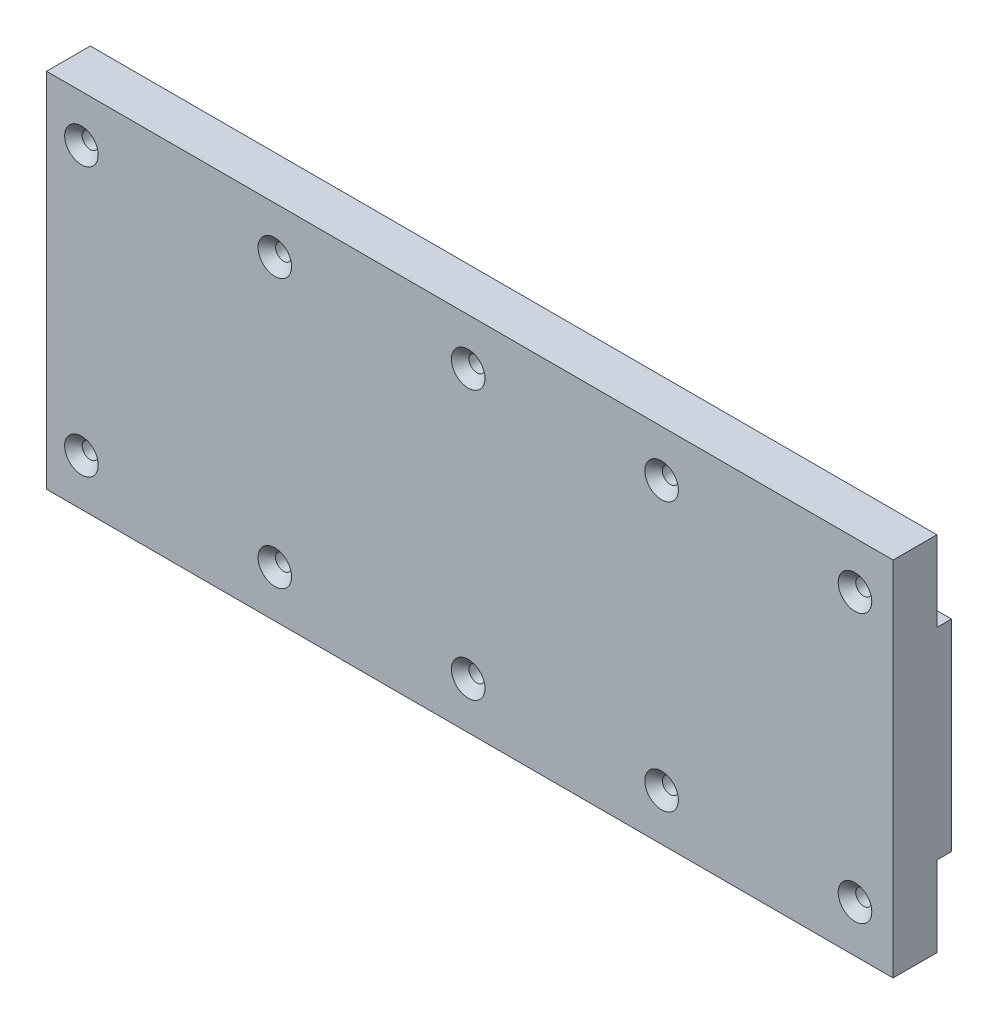
ISO-10303-21;
HEADER;
FILE_DESCRIPTION(('STEP AP214'),'2;1');
FILE_NAME('part.step','',(''),(''),'','','');
FILE_SCHEMA(('AUTOMOTIVE_DESIGN { 1 0 10303 214 1 1 1 1 }'));
ENDSEC;
DATA;
#1=APPLICATION_CONTEXT('core data for automotive mechanical design processes');
#2=APPLICATION_PROTOCOL_DEFINITION('international standard','automotive_design',2000,#1);
#3=PRODUCT_CONTEXT('',#1,'mechanical');
#4=PRODUCT('Part','Part','',(#3));
#5=PRODUCT_RELATED_PRODUCT_CATEGORY('part','',(#4));
#6=PRODUCT_DEFINITION_FORMATION('','',#4);
#7=PRODUCT_DEFINITION_CONTEXT('part definition',#1,'design');
#8=PRODUCT_DEFINITION('design','',#6,#7);
#9=PRODUCT_DEFINITION_SHAPE('','',#8);
#10=(LENGTH_UNIT() NAMED_UNIT(*) SI_UNIT(.MILLI.,.METRE.));
#11=(NAMED_UNIT(*) PLANE_ANGLE_UNIT() SI_UNIT($,.RADIAN.));
#12=(NAMED_UNIT(*) SI_UNIT($,.STERADIAN.) SOLID_ANGLE_UNIT());
#13=UNCERTAINTY_MEASURE_WITH_UNIT(LENGTH_MEASURE(1.E-05),#10,'distance_accuracy_value','');
#14=(GEOMETRIC_REPRESENTATION_CONTEXT(3) GLOBAL_UNCERTAINTY_ASSIGNED_CONTEXT((#13)) GLOBAL_UNIT_ASSIGNED_CONTEXT((#10,
#11,#12)) REPRESENTATION_CONTEXT('',''));
#15=CARTESIAN_POINT('',(0.,0.,0.));
#16=DIRECTION('',(0.,0.,1.));
#17=DIRECTION('',(1.,0.,0.));
#18=AXIS2_PLACEMENT_3D('',#15,#16,#17);
#19=CARTESIAN_POINT('',(-580.,0.,0.));
#20=DIRECTION('',(0.,0.,1.));
#21=DIRECTION('',(1.,0.,0.));
#22=AXIS2_PLACEMENT_3D('',#19,#20,#21);
#23=PLANE('',#22);
#24=CARTESIAN_POINT('',(-556.095351196761,216.,0.));
#25=DIRECTION('',(0.,0.,1.));
#26=DIRECTION('',(1.,0.,0.));
#27=AXIS2_PLACEMENT_3D('',#24,#25,#26);
#28=CIRCLE('',#27,11.5);
#29=CARTESIAN_POINT('',(-544.595351196761,216.,0.));
#30=VERTEX_POINT('',#29);
#31=EDGE_CURVE('E278',#30,#30,#28,.F.);
#32=ORIENTED_EDGE('',*,*,#31,.T.);
#33=EDGE_LOOP('',(#32));
#34=FACE_BOUND('',#33,.T.);
#35=CARTESIAN_POINT('',(-423.595351196761,216.,0.));
#36=DIRECTION('',(0.,0.,1.));
#37=DIRECTION('',(1.,0.,0.));
#38=AXIS2_PLACEMENT_3D('',#35,#36,#37);
#39=CIRCLE('',#38,11.5);
#40=CARTESIAN_POINT('',(-412.095351196761,216.,0.));
#41=VERTEX_POINT('',#40);
#42=EDGE_CURVE('E274',#41,#41,#39,.F.);
#43=ORIENTED_EDGE('',*,*,#42,.T.);
#44=EDGE_LOOP('',(#43));
#45=FACE_BOUND('',#44,.T.);
#46=CARTESIAN_POINT('',(-291.095351196761,216.,0.));
#47=DIRECTION('',(0.,0.,1.));
#48=DIRECTION('',(1.,0.,0.));
#49=AXIS2_PLACEMENT_3D('',#46,#47,#48);
#50=CIRCLE('',#49,11.5);
#51=CARTESIAN_POINT('',(-279.595351196761,216.,0.));
#52=VERTEX_POINT('',#51);
#53=EDGE_CURVE('E270',#52,#52,#50,.F.);
#54=ORIENTED_EDGE('',*,*,#53,.T.);
#55=EDGE_LOOP('',(#54));
#56=FACE_BOUND('',#55,.T.);
#57=CARTESIAN_POINT('',(-158.595351196761,216.,0.));
#58=DIRECTION('',(0.,0.,1.));
#59=DIRECTION('',(1.,0.,0.));
#60=AXIS2_PLACEMENT_3D('',#57,#58,#59);
#61=CIRCLE('',#60,11.5);
#62=CARTESIAN_POINT('',(-147.095351196761,216.,0.));
#63=VERTEX_POINT('',#62);
#64=EDGE_CURVE('E266',#63,#63,#61,.F.);
#65=ORIENTED_EDGE('',*,*,#64,.T.);
#66=EDGE_LOOP('',(#65));
#67=FACE_BOUND('',#66,.T.);
#68=CARTESIAN_POINT('',(-26.0953511967612,216.,0.));
#69=DIRECTION('',(0.,0.,1.));
#70=DIRECTION('',(1.,0.,0.));
#71=AXIS2_PLACEMENT_3D('',#68,#69,#70);
#72=CIRCLE('',#71,11.5);
#73=CARTESIAN_POINT('',(-14.5953511967612,216.,0.));
#74=VERTEX_POINT('',#73);
#75=EDGE_CURVE('E262',#74,#74,#72,.F.);
#76=ORIENTED_EDGE('',*,*,#75,.T.);
#77=EDGE_LOOP('',(#76));
#78=FACE_BOUND('',#77,.T.);
#79=CARTESIAN_POINT('',(-26.0953511967612,32.,0.));
#80=DIRECTION('',(0.,0.,1.));
#81=DIRECTION('',(1.,0.,0.));
#82=AXIS2_PLACEMENT_3D('',#79,#80,#81);
#83=CIRCLE('',#82,11.5000000000001);
#84=CARTESIAN_POINT('',(-14.5953511967611,32.,0.));
#85=VERTEX_POINT('',#84);
#86=EDGE_CURVE('E258',#85,#85,#83,.F.);
#87=ORIENTED_EDGE('',*,*,#86,.T.);
#88=EDGE_LOOP('',(#87));
#89=FACE_BOUND('',#88,.T.);
#90=CARTESIAN_POINT('',(-158.595351196761,32.,0.));
#91=DIRECTION('',(0.,0.,1.));
#92=DIRECTION('',(1.,0.,0.));
#93=AXIS2_PLACEMENT_3D('',#90,#91,#92);
#94=CIRCLE('',#93,11.4999999999999);
#95=CARTESIAN_POINT('',(-147.095351196761,32.,0.));
#96=VERTEX_POINT('',#95);
#97=EDGE_CURVE('E254',#96,#96,#94,.F.);
#98=ORIENTED_EDGE('',*,*,#97,.T.);
#99=EDGE_LOOP('',(#98));
#100=FACE_BOUND('',#99,.T.);
#101=CARTESIAN_POINT('',(-291.095351196761,32.,0.));
#102=DIRECTION('',(0.,0.,1.));
#103=DIRECTION('',(1.,0.,0.));
#104=AXIS2_PLACEMENT_3D('',#101,#102,#103);
#105=CIRCLE('',#104,11.5000000000001);
#106=CARTESIAN_POINT('',(-279.595351196761,32.,0.));
#107=VERTEX_POINT('',#106);
#108=EDGE_CURVE('E250',#107,#107,#105,.F.);
#109=ORIENTED_EDGE('',*,*,#108,.T.);
#110=EDGE_LOOP('',(#109));
#111=FACE_BOUND('',#110,.T.);
#112=CARTESIAN_POINT('',(-423.595351196761,32.,0.));
#113=DIRECTION('',(0.,0.,1.));
#114=DIRECTION('',(1.,0.,0.));
#115=AXIS2_PLACEMENT_3D('',#112,#113,#114);
#116=CIRCLE('',#115,11.5000000000001);
#117=CARTESIAN_POINT('',(-412.095351196761,32.,0.));
#118=VERTEX_POINT('',#117);
#119=EDGE_CURVE('E246',#118,#118,#116,.F.);
#120=ORIENTED_EDGE('',*,*,#119,.T.);
#121=EDGE_LOOP('',(#120));
#122=FACE_BOUND('',#121,.T.);
#123=CARTESIAN_POINT('',(-556.095351196761,32.,0.));
#124=DIRECTION('',(0.,0.,1.));
#125=DIRECTION('',(1.,0.,0.));
#126=AXIS2_PLACEMENT_3D('',#123,#124,#125);
#127=CIRCLE('',#126,11.5000000000001);
#128=CARTESIAN_POINT('',(-544.595351196761,32.,0.));
#129=VERTEX_POINT('',#128);
#130=EDGE_CURVE('E201',#129,#129,#127,.F.);
#131=ORIENTED_EDGE('',*,*,#130,.T.);
#132=EDGE_LOOP('',(#131));
#133=FACE_BOUND('',#132,.T.);
#134=DIRECTION('',(0.,-1.,0.));
#135=VECTOR('',#134,1.);
#136=CARTESIAN_POINT('',(0.,0.,0.));
#137=LINE('',#136,#135);
#138=CARTESIAN_POINT('',(0.,248.,0.));
#139=VERTEX_POINT('',#138);
#140=CARTESIAN_POINT('',(0.,0.,0.));
#141=VERTEX_POINT('',#140);
#142=EDGE_CURVE('E144',#139,#141,#137,.T.);
#143=ORIENTED_EDGE('',*,*,#142,.F.);
#144=DIRECTION('',(1.,0.,0.));
#145=VECTOR('',#144,1.);
#146=CARTESIAN_POINT('',(-580.,248.,0.));
#147=LINE('',#146,#145);
#148=CARTESIAN_POINT('',(-580.,248.,0.));
#149=VERTEX_POINT('',#148);
#150=EDGE_CURVE('E197',#149,#139,#147,.T.);
#151=ORIENTED_EDGE('',*,*,#150,.F.);
#152=DIRECTION('',(0.,-1.,0.));
#153=VECTOR('',#152,1.);
#154=CARTESIAN_POINT('',(-580.,0.,0.));
#155=LINE('',#154,#153);
#156=CARTESIAN_POINT('',(-580.,0.,0.));
#157=VERTEX_POINT('',#156);
#158=EDGE_CURVE('E170',#149,#157,#155,.T.);
#159=ORIENTED_EDGE('',*,*,#158,.T.);
#160=DIRECTION('',(1.,0.,0.));
#161=VECTOR('',#160,1.);
#162=CARTESIAN_POINT('',(-580.,0.,0.));
#163=LINE('',#162,#161);
#164=EDGE_CURVE('E183',#157,#141,#163,.T.);
#165=ORIENTED_EDGE('',*,*,#164,.T.);
#166=EDGE_LOOP('',(#143,#151,#159,#165));
#167=FACE_BOUND('',#166,.T.);
#168=ADVANCED_FACE('F44',(#34,#45,#56,#67,#78,#89,#100,#111,#122,#133,#167),#23,.T.);
#169=CARTESIAN_POINT('',(-580.,248.,0.));
#170=DIRECTION('',(0.,1.,0.));
#171=DIRECTION('',(0.,0.,1.));
#172=AXIS2_PLACEMENT_3D('',#169,#170,#171);
#173=PLANE('',#172);
#174=DIRECTION('',(1.,0.,0.));
#175=VECTOR('',#174,1.);
#176=CARTESIAN_POINT('',(-580.,248.,-30.));
#177=LINE('',#176,#175);
#178=CARTESIAN_POINT('',(-580.,248.,-30.));
#179=VERTEX_POINT('',#178);
#180=CARTESIAN_POINT('',(0.,248.,-30.));
#181=VERTEX_POINT('',#180);
#182=EDGE_CURVE('E155',#179,#181,#177,.T.);
#183=ORIENTED_EDGE('',*,*,#182,.F.);
#184=DIRECTION('',(0.,0.,1.));
#185=VECTOR('',#184,1.);
#186=CARTESIAN_POINT('',(-580.,248.,0.));
#187=LINE('',#186,#185);
#188=EDGE_CURVE('E180',#179,#149,#187,.T.);
#189=ORIENTED_EDGE('',*,*,#188,.T.);
#190=ORIENTED_EDGE('',*,*,#150,.T.);
#191=DIRECTION('',(0.,0.,1.));
#192=VECTOR('',#191,1.);
#193=CARTESIAN_POINT('',(0.,248.,0.));
#194=LINE('',#193,#192);
#195=EDGE_CURVE('E175',#181,#139,#194,.T.);
#196=ORIENTED_EDGE('',*,*,#195,.F.);
#197=EDGE_LOOP('',(#183,#189,#190,#196));
#198=FACE_BOUND('',#197,.T.);
#199=ADVANCED_FACE('F335',(#198),#173,.T.);
#200=CARTESIAN_POINT('',(-580.,0.,-40.));
#201=DIRECTION('',(0.,0.,-1.));
#202=DIRECTION('',(-1.,0.,0.));
#203=AXIS2_PLACEMENT_3D('',#200,#201,#202);
#204=PLANE('',#203);
#205=DIRECTION('',(1.,0.,0.));
#206=VECTOR('',#205,1.);
#207=CARTESIAN_POINT('',(-580.,55.,-40.));
#208=LINE('',#207,#206);
#209=CARTESIAN_POINT('',(-580.,55.,-40.));
#210=VERTEX_POINT('',#209);
#211=CARTESIAN_POINT('',(0.,55.,-40.));
#212=VERTEX_POINT('',#211);
#213=EDGE_CURVE('E141',#210,#212,#208,.T.);
#214=ORIENTED_EDGE('',*,*,#213,.F.);
#215=DIRECTION('',(0.,1.,0.));
#216=VECTOR('',#215,1.);
#217=CARTESIAN_POINT('',(-580.,0.,-40.));
#218=LINE('',#217,#216);
#219=CARTESIAN_POINT('',(-580.,193.,-40.));
#220=VERTEX_POINT('',#219);
#221=EDGE_CURVE('E132',#210,#220,#218,.T.);
#222=ORIENTED_EDGE('',*,*,#221,.T.);
#223=DIRECTION('',(1.,0.,0.));
#224=VECTOR('',#223,1.);
#225=CARTESIAN_POINT('',(-580.,193.,-40.));
#226=LINE('',#225,#224);
#227=CARTESIAN_POINT('',(0.,193.,-40.));
#228=VERTEX_POINT('',#227);
#229=EDGE_CURVE('E151',#220,#228,#226,.T.);
#230=ORIENTED_EDGE('',*,*,#229,.T.);
#231=DIRECTION('',(0.,1.,0.));
#232=VECTOR('',#231,1.);
#233=CARTESIAN_POINT('',(0.,0.,-40.));
#234=LINE('',#233,#232);
#235=EDGE_CURVE('E191',#212,#228,#234,.T.);
#236=ORIENTED_EDGE('',*,*,#235,.F.);
#237=EDGE_LOOP('',(#214,#222,#230,#236));
#238=FACE_BOUND('',#237,.T.);
#239=ADVANCED_FACE('F341',(#238),#204,.T.);
#240=CARTESIAN_POINT('',(-580.,0.,0.));
#241=DIRECTION('',(0.,-1.,0.));
#242=DIRECTION('',(0.,0.,-1.));
#243=AXIS2_PLACEMENT_3D('',#240,#241,#242);
#244=PLANE('',#243);
#245=DIRECTION('',(1.,0.,0.));
#246=VECTOR('',#245,1.);
#247=CARTESIAN_POINT('',(-580.,0.,-30.));
#248=LINE('',#247,#246);
#249=CARTESIAN_POINT('',(-580.,0.,-30.));
#250=VERTEX_POINT('',#249);
#251=CARTESIAN_POINT('',(0.,0.,-30.));
#252=VERTEX_POINT('',#251);
#253=EDGE_CURVE('E117',#250,#252,#248,.T.);
#254=ORIENTED_EDGE('',*,*,#253,.T.);
#255=DIRECTION('',(0.,0.,-1.));
#256=VECTOR('',#255,1.);
#257=CARTESIAN_POINT('',(0.,0.,0.));
#258=LINE('',#257,#256);
#259=EDGE_CURVE('E187',#141,#252,#258,.T.);
#260=ORIENTED_EDGE('',*,*,#259,.F.);
#261=ORIENTED_EDGE('',*,*,#164,.F.);
#262=DIRECTION('',(0.,0.,-1.));
#263=VECTOR('',#262,1.);
#264=CARTESIAN_POINT('',(-580.,0.,0.));
#265=LINE('',#264,#263);
#266=EDGE_CURVE('E174',#157,#250,#265,.T.);
#267=ORIENTED_EDGE('',*,*,#266,.T.);
#268=EDGE_LOOP('',(#254,#260,#261,#267));
#269=FACE_BOUND('',#268,.T.);
#270=ADVANCED_FACE('F347',(#269),#244,.T.);
#271=CARTESIAN_POINT('',(-580.,0.,0.));
#272=DIRECTION('',(-1.,0.,0.));
#273=DIRECTION('',(0.,0.,1.));
#274=AXIS2_PLACEMENT_3D('',#271,#272,#273);
#275=PLANE('',#274);
#276=DIRECTION('',(0.,0.,1.));
#277=VECTOR('',#276,1.);
#278=CARTESIAN_POINT('',(-580.,55.,-30.));
#279=LINE('',#278,#277);
#280=CARTESIAN_POINT('',(-580.,55.,-30.));
#281=VERTEX_POINT('',#280);
#282=EDGE_CURVE('E112',#210,#281,#279,.T.);
#283=ORIENTED_EDGE('',*,*,#282,.T.);
#284=DIRECTION('',(0.,-1.,0.));
#285=VECTOR('',#284,1.);
#286=CARTESIAN_POINT('',(-580.,55.,-30.));
#287=LINE('',#286,#285);
#288=EDGE_CURVE('E118',#281,#250,#287,.T.);
#289=ORIENTED_EDGE('',*,*,#288,.T.);
#290=ORIENTED_EDGE('',*,*,#266,.F.);
#291=ORIENTED_EDGE('',*,*,#158,.F.);
#292=ORIENTED_EDGE('',*,*,#188,.F.);
#293=DIRECTION('',(0.,-1.,0.));
#294=VECTOR('',#293,1.);
#295=CARTESIAN_POINT('',(-580.,193.,-30.));
#296=LINE('',#295,#294);
#297=CARTESIAN_POINT('',(-580.,193.,-30.));
#298=VERTEX_POINT('',#297);
#299=EDGE_CURVE('E162',#179,#298,#296,.T.);
#300=ORIENTED_EDGE('',*,*,#299,.T.);
#301=DIRECTION('',(0.,0.,-1.));
#302=VECTOR('',#301,1.);
#303=CARTESIAN_POINT('',(-580.,193.,-40.));
#304=LINE('',#303,#302);
#305=EDGE_CURVE('E150',#298,#220,#304,.T.);
#306=ORIENTED_EDGE('',*,*,#305,.T.);
#307=ORIENTED_EDGE('',*,*,#221,.F.);
#308=EDGE_LOOP('',(#283,#289,#290,#291,#292,#300,#306,#307));
#309=FACE_BOUND('',#308,.T.);
#310=ADVANCED_FACE('F129',(#309),#275,.T.);
#311=CARTESIAN_POINT('',(0.,0.,0.));
#312=DIRECTION('',(-1.,0.,0.));
#313=DIRECTION('',(0.,0.,1.));
#314=AXIS2_PLACEMENT_3D('',#311,#312,#313);
#315=PLANE('',#314);
#316=DIRECTION('',(0.,-1.,0.));
#317=VECTOR('',#316,1.);
#318=CARTESIAN_POINT('',(0.,55.,-30.));
#319=LINE('',#318,#317);
#320=CARTESIAN_POINT('',(0.,55.,-30.));
#321=VERTEX_POINT('',#320);
#322=EDGE_CURVE('E134',#321,#252,#319,.T.);
#323=ORIENTED_EDGE('',*,*,#322,.F.);
#324=DIRECTION('',(0.,0.,1.));
#325=VECTOR('',#324,1.);
#326=CARTESIAN_POINT('',(0.,55.,-30.));
#327=LINE('',#326,#325);
#328=EDGE_CURVE('E61',#212,#321,#327,.T.);
#329=ORIENTED_EDGE('',*,*,#328,.F.);
#330=ORIENTED_EDGE('',*,*,#235,.T.);
#331=DIRECTION('',(0.,0.,-1.));
#332=VECTOR('',#331,1.);
#333=CARTESIAN_POINT('',(0.,193.,-40.));
#334=LINE('',#333,#332);
#335=CARTESIAN_POINT('',(0.,193.,-30.));
#336=VERTEX_POINT('',#335);
#337=EDGE_CURVE('E159',#336,#228,#334,.T.);
#338=ORIENTED_EDGE('',*,*,#337,.F.);
#339=DIRECTION('',(0.,-1.,0.));
#340=VECTOR('',#339,1.);
#341=CARTESIAN_POINT('',(0.,193.,-30.));
#342=LINE('',#341,#340);
#343=EDGE_CURVE('E69',#181,#336,#342,.T.);
#344=ORIENTED_EDGE('',*,*,#343,.F.);
#345=ORIENTED_EDGE('',*,*,#195,.T.);
#346=ORIENTED_EDGE('',*,*,#142,.T.);
#347=ORIENTED_EDGE('',*,*,#259,.T.);
#348=EDGE_LOOP('',(#323,#329,#330,#338,#344,#345,#346,#347));
#349=FACE_BOUND('',#348,.T.);
#350=ADVANCED_FACE('F445',(#349),#315,.F.);
#351=CARTESIAN_POINT('',(-580.,193.,-30.));
#352=DIRECTION('',(0.,0.,1.));
#353=DIRECTION('',(1.,0.,0.));
#354=AXIS2_PLACEMENT_3D('',#351,#352,#353);
#355=PLANE('',#354);
#356=CARTESIAN_POINT('',(-556.095351196761,216.,-30.));
#357=DIRECTION('',(0.,0.,1.));
#358=DIRECTION('',(1.,0.,0.));
#359=AXIS2_PLACEMENT_3D('',#356,#357,#358);
#360=CIRCLE('',#359,5.49999999999996);
#361=CARTESIAN_POINT('',(-550.595351196761,216.,-30.));
#362=VERTEX_POINT('',#361);
#363=EDGE_CURVE('E158',#362,#362,#360,.F.);
#364=ORIENTED_EDGE('',*,*,#363,.F.);
#365=EDGE_LOOP('',(#364));
#366=FACE_BOUND('',#365,.T.);
#367=CARTESIAN_POINT('',(-423.595351196761,216.,-30.));
#368=DIRECTION('',(0.,0.,1.));
#369=DIRECTION('',(1.,0.,0.));
#370=AXIS2_PLACEMENT_3D('',#367,#368,#369);
#371=CIRCLE('',#370,5.49999999999996);
#372=CARTESIAN_POINT('',(-418.095351196761,216.,-30.));
#373=VERTEX_POINT('',#372);
#374=EDGE_CURVE('E236',#373,#373,#371,.F.);
#375=ORIENTED_EDGE('',*,*,#374,.F.);
#376=EDGE_LOOP('',(#375));
#377=FACE_BOUND('',#376,.T.);
#378=CARTESIAN_POINT('',(-291.095351196761,216.,-30.));
#379=DIRECTION('',(0.,0.,1.));
#380=DIRECTION('',(1.,0.,0.));
#381=AXIS2_PLACEMENT_3D('',#378,#379,#380);
#382=CIRCLE('',#381,5.49999999999996);
#383=CARTESIAN_POINT('',(-285.595351196761,216.,-30.));
#384=VERTEX_POINT('',#383);
#385=EDGE_CURVE('E232',#384,#384,#382,.F.);
#386=ORIENTED_EDGE('',*,*,#385,.F.);
#387=EDGE_LOOP('',(#386));
#388=FACE_BOUND('',#387,.T.);
#389=CARTESIAN_POINT('',(-158.595351196761,216.,-30.));
#390=DIRECTION('',(0.,0.,1.));
#391=DIRECTION('',(1.,0.,0.));
#392=AXIS2_PLACEMENT_3D('',#389,#390,#391);
#393=CIRCLE('',#392,5.49999999999996);
#394=CARTESIAN_POINT('',(-153.095351196761,216.,-30.));
#395=VERTEX_POINT('',#394);
#396=EDGE_CURVE('E228',#395,#395,#393,.F.);
#397=ORIENTED_EDGE('',*,*,#396,.F.);
#398=EDGE_LOOP('',(#397));
#399=FACE_BOUND('',#398,.T.);
#400=CARTESIAN_POINT('',(-26.0953511967612,216.,-30.));
#401=DIRECTION('',(0.,0.,1.));
#402=DIRECTION('',(1.,0.,0.));
#403=AXIS2_PLACEMENT_3D('',#400,#401,#402);
#404=CIRCLE('',#403,5.49999999999996);
#405=CARTESIAN_POINT('',(-20.5953511967612,216.,-30.));
#406=VERTEX_POINT('',#405);
#407=EDGE_CURVE('E224',#406,#406,#404,.F.);
#408=ORIENTED_EDGE('',*,*,#407,.F.);
#409=EDGE_LOOP('',(#408));
#410=FACE_BOUND('',#409,.T.);
#411=ORIENTED_EDGE('',*,*,#343,.T.);
#412=DIRECTION('',(1.,0.,0.));
#413=VECTOR('',#412,1.);
#414=CARTESIAN_POINT('',(-580.,193.,-30.));
#415=LINE('',#414,#413);
#416=EDGE_CURVE('E147',#298,#336,#415,.T.);
#417=ORIENTED_EDGE('',*,*,#416,.F.);
#418=ORIENTED_EDGE('',*,*,#299,.F.);
#419=ORIENTED_EDGE('',*,*,#182,.T.);
#420=EDGE_LOOP('',(#411,#417,#418,#419));
#421=FACE_BOUND('',#420,.T.);
#422=ADVANCED_FACE('F442',(#366,#377,#388,#399,#410,#421),#355,.F.);
#423=CARTESIAN_POINT('',(-580.,193.,-40.));
#424=DIRECTION('',(0.,-1.,0.));
#425=DIRECTION('',(0.,0.,-1.));
#426=AXIS2_PLACEMENT_3D('',#423,#424,#425);
#427=PLANE('',#426);
#428=ORIENTED_EDGE('',*,*,#337,.T.);
#429=ORIENTED_EDGE('',*,*,#229,.F.);
#430=ORIENTED_EDGE('',*,*,#305,.F.);
#431=ORIENTED_EDGE('',*,*,#416,.T.);
#432=EDGE_LOOP('',(#428,#429,#430,#431));
#433=FACE_BOUND('',#432,.T.);
#434=ADVANCED_FACE('F441',(#433),#427,.F.);
#435=CARTESIAN_POINT('',(-580.,55.,-30.));
#436=DIRECTION('',(0.,1.,0.));
#437=DIRECTION('',(0.,0.,1.));
#438=AXIS2_PLACEMENT_3D('',#435,#436,#437);
#439=PLANE('',#438);
#440=ORIENTED_EDGE('',*,*,#328,.T.);
#441=DIRECTION('',(1.,0.,0.));
#442=VECTOR('',#441,1.);
#443=CARTESIAN_POINT('',(-580.,55.,-30.));
#444=LINE('',#443,#442);
#445=EDGE_CURVE('E108',#281,#321,#444,.T.);
#446=ORIENTED_EDGE('',*,*,#445,.F.);
#447=ORIENTED_EDGE('',*,*,#282,.F.);
#448=ORIENTED_EDGE('',*,*,#213,.T.);
#449=EDGE_LOOP('',(#440,#446,#447,#448));
#450=FACE_BOUND('',#449,.T.);
#451=ADVANCED_FACE('F110',(#450),#439,.F.);
#452=CARTESIAN_POINT('',(-580.,55.,-30.));
#453=DIRECTION('',(0.,0.,1.));
#454=DIRECTION('',(1.,0.,0.));
#455=AXIS2_PLACEMENT_3D('',#452,#453,#454);
#456=PLANE('',#455);
#457=CARTESIAN_POINT('',(-26.0953511967612,32.,-30.));
#458=DIRECTION('',(0.,0.,1.));
#459=DIRECTION('',(1.,0.,0.));
#460=AXIS2_PLACEMENT_3D('',#457,#458,#459);
#461=CIRCLE('',#460,5.49999999999996);
#462=CARTESIAN_POINT('',(-20.5953511967612,32.,-30.));
#463=VERTEX_POINT('',#462);
#464=EDGE_CURVE('E220',#463,#463,#461,.T.);
#465=ORIENTED_EDGE('',*,*,#464,.T.);
#466=EDGE_LOOP('',(#465));
#467=FACE_BOUND('',#466,.T.);
#468=CARTESIAN_POINT('',(-158.595351196761,32.,-30.));
#469=DIRECTION('',(0.,0.,1.));
#470=DIRECTION('',(1.,0.,0.));
#471=AXIS2_PLACEMENT_3D('',#468,#469,#470);
#472=CIRCLE('',#471,5.49999999999996);
#473=CARTESIAN_POINT('',(-153.095351196761,32.,-30.));
#474=VERTEX_POINT('',#473);
#475=EDGE_CURVE('E216',#474,#474,#472,.T.);
#476=ORIENTED_EDGE('',*,*,#475,.T.);
#477=EDGE_LOOP('',(#476));
#478=FACE_BOUND('',#477,.T.);
#479=CARTESIAN_POINT('',(-291.095351196761,32.,-30.));
#480=DIRECTION('',(0.,0.,1.));
#481=DIRECTION('',(1.,0.,0.));
#482=AXIS2_PLACEMENT_3D('',#479,#480,#481);
#483=CIRCLE('',#482,5.49999999999996);
#484=CARTESIAN_POINT('',(-285.595351196761,32.,-30.));
#485=VERTEX_POINT('',#484);
#486=EDGE_CURVE('E212',#485,#485,#483,.T.);
#487=ORIENTED_EDGE('',*,*,#486,.T.);
#488=EDGE_LOOP('',(#487));
#489=FACE_BOUND('',#488,.T.);
#490=CARTESIAN_POINT('',(-423.595351196761,32.,-30.));
#491=DIRECTION('',(0.,0.,1.));
#492=DIRECTION('',(1.,0.,0.));
#493=AXIS2_PLACEMENT_3D('',#490,#491,#492);
#494=CIRCLE('',#493,5.49999999999996);
#495=CARTESIAN_POINT('',(-418.095351196761,32.,-30.));
#496=VERTEX_POINT('',#495);
#497=EDGE_CURVE('E208',#496,#496,#494,.T.);
#498=ORIENTED_EDGE('',*,*,#497,.T.);
#499=EDGE_LOOP('',(#498));
#500=FACE_BOUND('',#499,.T.);
#501=CARTESIAN_POINT('',(-556.095351196761,32.,-30.));
#502=DIRECTION('',(0.,0.,1.));
#503=DIRECTION('',(1.,0.,0.));
#504=AXIS2_PLACEMENT_3D('',#501,#502,#503);
#505=CIRCLE('',#504,5.49999999999996);
#506=CARTESIAN_POINT('',(-550.595351196761,32.,-30.));
#507=VERTEX_POINT('',#506);
#508=EDGE_CURVE('E204',#507,#507,#505,.T.);
#509=ORIENTED_EDGE('',*,*,#508,.T.);
#510=EDGE_LOOP('',(#509));
#511=FACE_BOUND('',#510,.T.);
#512=ORIENTED_EDGE('',*,*,#322,.T.);
#513=ORIENTED_EDGE('',*,*,#253,.F.);
#514=ORIENTED_EDGE('',*,*,#288,.F.);
#515=ORIENTED_EDGE('',*,*,#445,.T.);
#516=EDGE_LOOP('',(#512,#513,#514,#515));
#517=FACE_BOUND('',#516,.T.);
#518=ADVANCED_FACE('F121',(#467,#478,#489,#500,#511,#517),#456,.F.);
#519=CARTESIAN_POINT('',(-556.095351196761,32.,-40.));
#520=DIRECTION('',(0.,0.,1.));
#521=DIRECTION('',(1.,0.,0.));
#522=AXIS2_PLACEMENT_3D('',#519,#520,#521);
#523=CYLINDRICAL_SURFACE('',#522,5.49999999999996);
#524=CARTESIAN_POINT('',(-556.095351196761,32.,-6.00000000000007));
#525=DIRECTION('',(0.,0.,1.));
#526=DIRECTION('',(1.,0.,0.));
#527=AXIS2_PLACEMENT_3D('',#524,#525,#526);
#528=CIRCLE('',#527,5.49999999999996);
#529=CARTESIAN_POINT('',(-550.595351196761,32.,-6.00000000000007));
#530=VERTEX_POINT('',#529);
#531=EDGE_CURVE('E11',#530,#530,#528,.T.);
#532=ORIENTED_EDGE('',*,*,#531,.T.);
#533=EDGE_LOOP('',(#532));
#534=FACE_BOUND('',#533,.T.);
#535=ORIENTED_EDGE('',*,*,#508,.F.);
#536=EDGE_LOOP('',(#535));
#537=FACE_BOUND('',#536,.T.);
#538=ADVANCED_FACE('F420',(#534,#537),#523,.F.);
#539=CARTESIAN_POINT('',(-423.595351196761,32.,-40.));
#540=DIRECTION('',(0.,0.,1.));
#541=DIRECTION('',(1.,0.,0.));
#542=AXIS2_PLACEMENT_3D('',#539,#540,#541);
#543=CYLINDRICAL_SURFACE('',#542,5.49999999999996);
#544=CARTESIAN_POINT('',(-423.595351196761,32.,-6.00000000000007));
#545=DIRECTION('',(0.,0.,1.));
#546=DIRECTION('',(1.,0.,0.));
#547=AXIS2_PLACEMENT_3D('',#544,#545,#546);
#548=CIRCLE('',#547,5.49999999999996);
#549=CARTESIAN_POINT('',(-418.095351196761,32.,-6.00000000000007));
#550=VERTEX_POINT('',#549);
#551=EDGE_CURVE('E54',#550,#550,#548,.T.);
#552=ORIENTED_EDGE('',*,*,#551,.T.);
#553=EDGE_LOOP('',(#552));
#554=FACE_BOUND('',#553,.T.);
#555=ORIENTED_EDGE('',*,*,#497,.F.);
#556=EDGE_LOOP('',(#555));
#557=FACE_BOUND('',#556,.T.);
#558=ADVANCED_FACE('F317',(#554,#557),#543,.F.);
#559=CARTESIAN_POINT('',(-291.095351196761,32.,-40.));
#560=DIRECTION('',(0.,0.,1.));
#561=DIRECTION('',(1.,0.,0.));
#562=AXIS2_PLACEMENT_3D('',#559,#560,#561);
#563=CYLINDRICAL_SURFACE('',#562,5.49999999999996);
#564=CARTESIAN_POINT('',(-291.095351196761,32.,-6.00000000000007));
#565=DIRECTION('',(0.,0.,1.));
#566=DIRECTION('',(1.,0.,0.));
#567=AXIS2_PLACEMENT_3D('',#564,#565,#566);
#568=CIRCLE('',#567,5.49999999999996);
#569=CARTESIAN_POINT('',(-285.595351196761,32.,-6.00000000000007));
#570=VERTEX_POINT('',#569);
#571=EDGE_CURVE('E310',#570,#570,#568,.T.);
#572=ORIENTED_EDGE('',*,*,#571,.T.);
#573=EDGE_LOOP('',(#572));
#574=FACE_BOUND('',#573,.T.);
#575=ORIENTED_EDGE('',*,*,#486,.F.);
#576=EDGE_LOOP('',(#575));
#577=FACE_BOUND('',#576,.T.);
#578=ADVANCED_FACE('F414',(#574,#577),#563,.F.);
#579=CARTESIAN_POINT('',(-158.595351196761,32.,-40.));
#580=DIRECTION('',(0.,0.,1.));
#581=DIRECTION('',(1.,0.,0.));
#582=AXIS2_PLACEMENT_3D('',#579,#580,#581);
#583=CYLINDRICAL_SURFACE('',#582,5.49999999999996);
#584=CARTESIAN_POINT('',(-158.595351196761,32.,-5.9999999999999));
#585=DIRECTION('',(0.,0.,1.));
#586=DIRECTION('',(1.,0.,0.));
#587=AXIS2_PLACEMENT_3D('',#584,#585,#586);
#588=CIRCLE('',#587,5.49999999999996);
#589=CARTESIAN_POINT('',(-153.095351196761,32.,-5.9999999999999));
#590=VERTEX_POINT('',#589);
#591=EDGE_CURVE('E306',#590,#590,#588,.T.);
#592=ORIENTED_EDGE('',*,*,#591,.T.);
#593=EDGE_LOOP('',(#592));
#594=FACE_BOUND('',#593,.T.);
#595=ORIENTED_EDGE('',*,*,#475,.F.);
#596=EDGE_LOOP('',(#595));
#597=FACE_BOUND('',#596,.T.);
#598=ADVANCED_FACE('F410',(#594,#597),#583,.F.);
#599=CARTESIAN_POINT('',(-26.0953511967612,32.,-40.));
#600=DIRECTION('',(0.,0.,1.));
#601=DIRECTION('',(1.,0.,0.));
#602=AXIS2_PLACEMENT_3D('',#599,#600,#601);
#603=CYLINDRICAL_SURFACE('',#602,5.49999999999996);
#604=CARTESIAN_POINT('',(-26.0953511967612,32.,-6.00000000000007));
#605=DIRECTION('',(0.,0.,1.));
#606=DIRECTION('',(1.,0.,0.));
#607=AXIS2_PLACEMENT_3D('',#604,#605,#606);
#608=CIRCLE('',#607,5.49999999999996);
#609=CARTESIAN_POINT('',(-20.5953511967612,32.,-6.00000000000007));
#610=VERTEX_POINT('',#609);
#611=EDGE_CURVE('E302',#610,#610,#608,.T.);
#612=ORIENTED_EDGE('',*,*,#611,.T.);
#613=EDGE_LOOP('',(#612));
#614=FACE_BOUND('',#613,.T.);
#615=ORIENTED_EDGE('',*,*,#464,.F.);
#616=EDGE_LOOP('',(#615));
#617=FACE_BOUND('',#616,.T.);
#618=ADVANCED_FACE('F413',(#614,#617),#603,.F.);
#619=CARTESIAN_POINT('',(-26.0953511967612,216.,-40.));
#620=DIRECTION('',(0.,0.,1.));
#621=DIRECTION('',(1.,0.,0.));
#622=AXIS2_PLACEMENT_3D('',#619,#620,#621);
#623=CYLINDRICAL_SURFACE('',#622,5.49999999999996);
#624=CARTESIAN_POINT('',(-26.0953511967612,216.,-6.00000000000009));
#625=DIRECTION('',(0.,0.,1.));
#626=DIRECTION('',(1.,0.,0.));
#627=AXIS2_PLACEMENT_3D('',#624,#625,#626);
#628=CIRCLE('',#627,5.49999999999996);
#629=CARTESIAN_POINT('',(-20.5953511967612,216.,-6.00000000000009));
#630=VERTEX_POINT('',#629);
#631=EDGE_CURVE('E298',#630,#630,#628,.T.);
#632=ORIENTED_EDGE('',*,*,#631,.T.);
#633=EDGE_LOOP('',(#632));
#634=FACE_BOUND('',#633,.T.);
#635=ORIENTED_EDGE('',*,*,#407,.T.);
#636=EDGE_LOOP('',(#635));
#637=FACE_BOUND('',#636,.T.);
#638=ADVANCED_FACE('F540',(#634,#637),#623,.F.);
#639=CARTESIAN_POINT('',(-158.595351196761,216.,-40.));
#640=DIRECTION('',(0.,0.,1.));
#641=DIRECTION('',(1.,0.,0.));
#642=AXIS2_PLACEMENT_3D('',#639,#640,#641);
#643=CYLINDRICAL_SURFACE('',#642,5.49999999999996);
#644=CARTESIAN_POINT('',(-158.595351196761,216.,-6.00000000000003));
#645=DIRECTION('',(0.,0.,1.));
#646=DIRECTION('',(1.,0.,0.));
#647=AXIS2_PLACEMENT_3D('',#644,#645,#646);
#648=CIRCLE('',#647,5.49999999999996);
#649=CARTESIAN_POINT('',(-153.095351196761,216.,-6.00000000000003));
#650=VERTEX_POINT('',#649);
#651=EDGE_CURVE('E294',#650,#650,#648,.T.);
#652=ORIENTED_EDGE('',*,*,#651,.T.);
#653=EDGE_LOOP('',(#652));
#654=FACE_BOUND('',#653,.T.);
#655=ORIENTED_EDGE('',*,*,#396,.T.);
#656=EDGE_LOOP('',(#655));
#657=FACE_BOUND('',#656,.T.);
#658=ADVANCED_FACE('F551',(#654,#657),#643,.F.);
#659=CARTESIAN_POINT('',(-291.095351196761,216.,-40.));
#660=DIRECTION('',(0.,0.,1.));
#661=DIRECTION('',(1.,0.,0.));
#662=AXIS2_PLACEMENT_3D('',#659,#660,#661);
#663=CYLINDRICAL_SURFACE('',#662,5.49999999999996);
#664=CARTESIAN_POINT('',(-291.095351196761,216.,-6.00000000000002));
#665=DIRECTION('',(0.,0.,1.));
#666=DIRECTION('',(1.,0.,0.));
#667=AXIS2_PLACEMENT_3D('',#664,#665,#666);
#668=CIRCLE('',#667,5.49999999999996);
#669=CARTESIAN_POINT('',(-285.595351196761,216.,-6.00000000000002));
#670=VERTEX_POINT('',#669);
#671=EDGE_CURVE('E290',#670,#670,#668,.T.);
#672=ORIENTED_EDGE('',*,*,#671,.T.);
#673=EDGE_LOOP('',(#672));
#674=FACE_BOUND('',#673,.T.);
#675=ORIENTED_EDGE('',*,*,#385,.T.);
#676=EDGE_LOOP('',(#675));
#677=FACE_BOUND('',#676,.T.);
#678=ADVANCED_FACE('F562',(#674,#677),#663,.F.);
#679=CARTESIAN_POINT('',(-423.595351196761,216.,-40.));
#680=DIRECTION('',(0.,0.,1.));
#681=DIRECTION('',(1.,0.,0.));
#682=AXIS2_PLACEMENT_3D('',#679,#680,#681);
#683=CYLINDRICAL_SURFACE('',#682,5.49999999999996);
#684=CARTESIAN_POINT('',(-423.595351196761,216.,-6.00000000000002));
#685=DIRECTION('',(0.,0.,1.));
#686=DIRECTION('',(1.,0.,0.));
#687=AXIS2_PLACEMENT_3D('',#684,#685,#686);
#688=CIRCLE('',#687,5.49999999999996);
#689=CARTESIAN_POINT('',(-418.095351196761,216.,-6.00000000000002));
#690=VERTEX_POINT('',#689);
#691=EDGE_CURVE('E286',#690,#690,#688,.T.);
#692=ORIENTED_EDGE('',*,*,#691,.T.);
#693=EDGE_LOOP('',(#692));
#694=FACE_BOUND('',#693,.T.);
#695=ORIENTED_EDGE('',*,*,#374,.T.);
#696=EDGE_LOOP('',(#695));
#697=FACE_BOUND('',#696,.T.);
#698=ADVANCED_FACE('F573',(#694,#697),#683,.F.);
#699=CARTESIAN_POINT('',(-556.095351196761,216.,-40.));
#700=DIRECTION('',(0.,0.,1.));
#701=DIRECTION('',(1.,0.,0.));
#702=AXIS2_PLACEMENT_3D('',#699,#700,#701);
#703=CYLINDRICAL_SURFACE('',#702,5.49999999999996);
#704=CARTESIAN_POINT('',(-556.095351196761,216.,-6.00000000000002));
#705=DIRECTION('',(0.,0.,1.));
#706=DIRECTION('',(1.,0.,0.));
#707=AXIS2_PLACEMENT_3D('',#704,#705,#706);
#708=CIRCLE('',#707,5.49999999999996);
#709=CARTESIAN_POINT('',(-550.595351196761,216.,-6.00000000000002));
#710=VERTEX_POINT('',#709);
#711=EDGE_CURVE('E282',#710,#710,#708,.T.);
#712=ORIENTED_EDGE('',*,*,#711,.T.);
#713=EDGE_LOOP('',(#712));
#714=FACE_BOUND('',#713,.T.);
#715=ORIENTED_EDGE('',*,*,#363,.T.);
#716=EDGE_LOOP('',(#715));
#717=FACE_BOUND('',#716,.T.);
#718=ADVANCED_FACE('F357',(#714,#717),#703,.F.);
#719=CARTESIAN_POINT('',(-556.095351196761,216.,0.));
#720=DIRECTION('',(0.,0.,1.));
#721=DIRECTION('',(1.,0.,0.));
#722=AXIS2_PLACEMENT_3D('',#719,#720,#721);
#723=CONICAL_SURFACE('',#722,11.5,0.785398163397447);
#724=ORIENTED_EDGE('',*,*,#711,.F.);
#725=EDGE_LOOP('',(#724));
#726=FACE_BOUND('',#725,.T.);
#727=ORIENTED_EDGE('',*,*,#31,.F.);
#728=EDGE_LOOP('',(#727));
#729=FACE_BOUND('',#728,.T.);
#730=ADVANCED_FACE('F350',(#726,#729),#723,.F.);
#731=CARTESIAN_POINT('',(-423.595351196761,216.,0.));
#732=DIRECTION('',(0.,0.,1.));
#733=DIRECTION('',(1.,0.,0.));
#734=AXIS2_PLACEMENT_3D('',#731,#732,#733);
#735=CONICAL_SURFACE('',#734,11.5,0.785398163397447);
#736=ORIENTED_EDGE('',*,*,#691,.F.);
#737=EDGE_LOOP('',(#736));
#738=FACE_BOUND('',#737,.T.);
#739=ORIENTED_EDGE('',*,*,#42,.F.);
#740=EDGE_LOOP('',(#739));
#741=FACE_BOUND('',#740,.T.);
#742=ADVANCED_FACE('F356',(#738,#741),#735,.F.);
#743=CARTESIAN_POINT('',(-291.095351196761,216.,0.));
#744=DIRECTION('',(0.,0.,1.));
#745=DIRECTION('',(1.,0.,0.));
#746=AXIS2_PLACEMENT_3D('',#743,#744,#745);
#747=CONICAL_SURFACE('',#746,11.5,0.785398163397447);
#748=ORIENTED_EDGE('',*,*,#671,.F.);
#749=EDGE_LOOP('',(#748));
#750=FACE_BOUND('',#749,.T.);
#751=ORIENTED_EDGE('',*,*,#53,.F.);
#752=EDGE_LOOP('',(#751));
#753=FACE_BOUND('',#752,.T.);
#754=ADVANCED_FACE('F364',(#750,#753),#747,.F.);
#755=CARTESIAN_POINT('',(-158.595351196761,216.,0.));
#756=DIRECTION('',(0.,0.,1.));
#757=DIRECTION('',(1.,0.,0.));
#758=AXIS2_PLACEMENT_3D('',#755,#756,#757);
#759=CONICAL_SURFACE('',#758,11.5,0.785398163397446);
#760=ORIENTED_EDGE('',*,*,#651,.F.);
#761=EDGE_LOOP('',(#760));
#762=FACE_BOUND('',#761,.T.);
#763=ORIENTED_EDGE('',*,*,#64,.F.);
#764=EDGE_LOOP('',(#763));
#765=FACE_BOUND('',#764,.T.);
#766=ADVANCED_FACE('F371',(#762,#765),#759,.F.);
#767=CARTESIAN_POINT('',(-26.0953511967612,216.,0.));
#768=DIRECTION('',(0.,0.,1.));
#769=DIRECTION('',(1.,0.,0.));
#770=AXIS2_PLACEMENT_3D('',#767,#768,#769);
#771=CONICAL_SURFACE('',#770,11.5,0.785398163397445);
#772=ORIENTED_EDGE('',*,*,#631,.F.);
#773=EDGE_LOOP('',(#772));
#774=FACE_BOUND('',#773,.T.);
#775=ORIENTED_EDGE('',*,*,#75,.F.);
#776=EDGE_LOOP('',(#775));
#777=FACE_BOUND('',#776,.T.);
#778=ADVANCED_FACE('F378',(#774,#777),#771,.F.);
#779=CARTESIAN_POINT('',(-26.0953511967612,32.,-6.00000000000007));
#780=DIRECTION('',(0.,0.,1.));
#781=DIRECTION('',(1.,0.,0.));
#782=AXIS2_PLACEMENT_3D('',#779,#780,#781);
#783=CONICAL_SURFACE('',#782,5.49999999999996,0.785398163397452);
#784=ORIENTED_EDGE('',*,*,#86,.F.);
#785=EDGE_LOOP('',(#784));
#786=FACE_BOUND('',#785,.T.);
#787=ORIENTED_EDGE('',*,*,#611,.F.);
#788=EDGE_LOOP('',(#787));
#789=FACE_BOUND('',#788,.T.);
#790=ADVANCED_FACE('F385',(#786,#789),#783,.F.);
#791=CARTESIAN_POINT('',(-158.595351196761,32.,-5.9999999999999));
#792=DIRECTION('',(0.,0.,1.));
#793=DIRECTION('',(1.,0.,0.));
#794=AXIS2_PLACEMENT_3D('',#791,#792,#793);
#795=CONICAL_SURFACE('',#794,5.49999999999996,0.785398163397452);
#796=ORIENTED_EDGE('',*,*,#97,.F.);
#797=EDGE_LOOP('',(#796));
#798=FACE_BOUND('',#797,.T.);
#799=ORIENTED_EDGE('',*,*,#591,.F.);
#800=EDGE_LOOP('',(#799));
#801=FACE_BOUND('',#800,.T.);
#802=ADVANCED_FACE('F329',(#798,#801),#795,.F.);
#803=CARTESIAN_POINT('',(-291.095351196761,32.,-6.00000000000007));
#804=DIRECTION('',(0.,0.,1.));
#805=DIRECTION('',(1.,0.,0.));
#806=AXIS2_PLACEMENT_3D('',#803,#804,#805);
#807=CONICAL_SURFACE('',#806,5.49999999999996,0.785398163397452);
#808=ORIENTED_EDGE('',*,*,#108,.F.);
#809=EDGE_LOOP('',(#808));
#810=FACE_BOUND('',#809,.T.);
#811=ORIENTED_EDGE('',*,*,#571,.F.);
#812=EDGE_LOOP('',(#811));
#813=FACE_BOUND('',#812,.T.);
#814=ADVANCED_FACE('F322',(#810,#813),#807,.F.);
#815=CARTESIAN_POINT('',(-423.595351196761,32.,-6.00000000000007));
#816=DIRECTION('',(0.,0.,1.));
#817=DIRECTION('',(1.,0.,0.));
#818=AXIS2_PLACEMENT_3D('',#815,#816,#817);
#819=CONICAL_SURFACE('',#818,5.49999999999996,0.785398163397452);
#820=ORIENTED_EDGE('',*,*,#119,.F.);
#821=EDGE_LOOP('',(#820));
#822=FACE_BOUND('',#821,.T.);
#823=ORIENTED_EDGE('',*,*,#551,.F.);
#824=EDGE_LOOP('',(#823));
#825=FACE_BOUND('',#824,.T.);
#826=ADVANCED_FACE('F320',(#822,#825),#819,.F.);
#827=CARTESIAN_POINT('',(-556.095351196761,32.,-6.00000000000007));
#828=DIRECTION('',(0.,0.,1.));
#829=DIRECTION('',(1.,0.,0.));
#830=AXIS2_PLACEMENT_3D('',#827,#828,#829);
#831=CONICAL_SURFACE('',#830,5.49999999999996,0.785398163397452);
#832=ORIENTED_EDGE('',*,*,#130,.F.);
#833=EDGE_LOOP('',(#832));
#834=FACE_BOUND('',#833,.T.);
#835=ORIENTED_EDGE('',*,*,#531,.F.);
#836=EDGE_LOOP('',(#835));
#837=FACE_BOUND('',#836,.T.);
#838=ADVANCED_FACE('F47',(#834,#837),#831,.F.);
#839=CLOSED_SHELL('',(#168,#199,#239,#270,#310,#350,#422,#434,#451,#518,#538,#558,#578,#598,
#618,#638,#658,#678,#698,#718,#730,#742,#754,#766,#778,#790,#802,#814,#826,#838));
#840=MANIFOLD_SOLID_BREP('B2',#839);
#841=ADVANCED_BREP_SHAPE_REPRESENTATION('',(#18,#840),#14);
#842=SHAPE_DEFINITION_REPRESENTATION(#9,#841);
ENDSEC;
END-ISO-10303-21;
